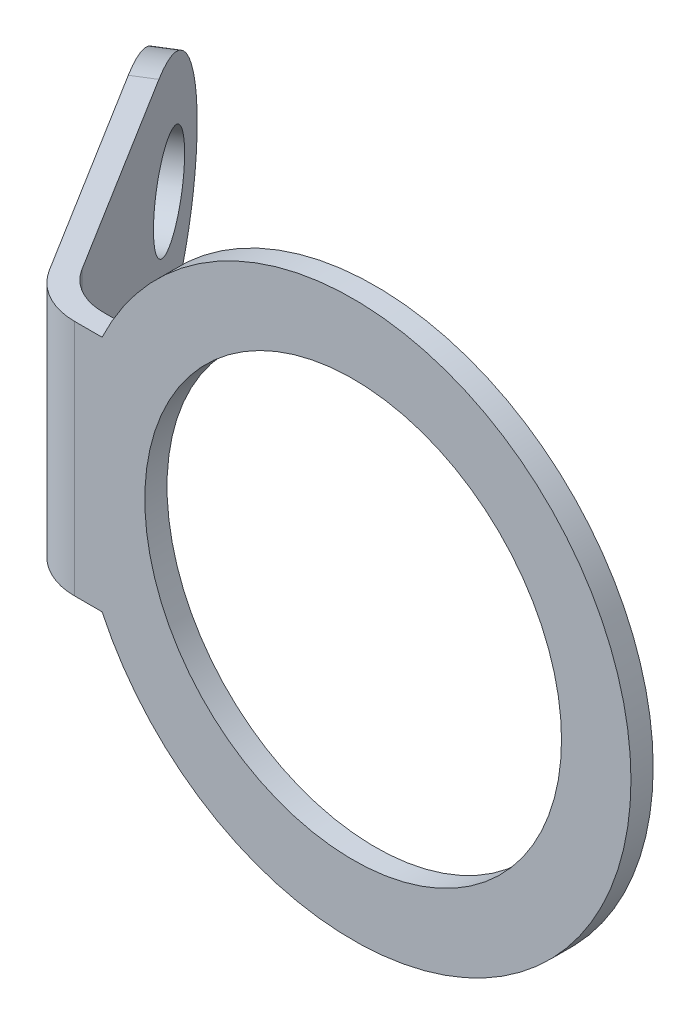
ISO-10303-21;
HEADER;
FILE_DESCRIPTION(('STEP AP214'),'2;1');
FILE_NAME('part.step','',(''),(''),'','','');
FILE_SCHEMA(('AUTOMOTIVE_DESIGN { 1 0 10303 214 1 1 1 1 }'));
ENDSEC;
DATA;
#1=APPLICATION_CONTEXT('core data for automotive mechanical design processes');
#2=APPLICATION_PROTOCOL_DEFINITION('international standard','automotive_design',2000,#1);
#3=PRODUCT_CONTEXT('',#1,'mechanical');
#4=PRODUCT('Part','Part','',(#3));
#5=PRODUCT_RELATED_PRODUCT_CATEGORY('part','',(#4));
#6=PRODUCT_DEFINITION_FORMATION('','',#4);
#7=PRODUCT_DEFINITION_CONTEXT('part definition',#1,'design');
#8=PRODUCT_DEFINITION('design','',#6,#7);
#9=PRODUCT_DEFINITION_SHAPE('','',#8);
#10=(LENGTH_UNIT() NAMED_UNIT(*) SI_UNIT(.MILLI.,.METRE.));
#11=(NAMED_UNIT(*) PLANE_ANGLE_UNIT() SI_UNIT($,.RADIAN.));
#12=(NAMED_UNIT(*) SI_UNIT($,.STERADIAN.) SOLID_ANGLE_UNIT());
#13=UNCERTAINTY_MEASURE_WITH_UNIT(LENGTH_MEASURE(1.E-05),#10,'distance_accuracy_value','');
#14=(GEOMETRIC_REPRESENTATION_CONTEXT(3) GLOBAL_UNCERTAINTY_ASSIGNED_CONTEXT((#13)) GLOBAL_UNIT_ASSIGNED_CONTEXT((#10,
#11,#12)) REPRESENTATION_CONTEXT('',''));
#15=CARTESIAN_POINT('',(0.,0.,0.));
#16=DIRECTION('',(0.,0.,1.));
#17=DIRECTION('',(1.,0.,0.));
#18=AXIS2_PLACEMENT_3D('',#15,#16,#17);
#19=CARTESIAN_POINT('',(-7.36753722158935,2.7178,0.267996011223815));
#20=DIRECTION('',(0.849523235706866,0.,-0.527551203196559));
#21=DIRECTION('',(-0.527551203196559,0.,-0.849523235706866));
#22=AXIS2_PLACEMENT_3D('',#19,#20,#21);
#23=PLANE('',#22);
#24=DIRECTION('',(0.52755120319652,0.,0.84952323570689));
#25=VECTOR('',#24,1.);
#26=CARTESIAN_POINT('',(-7.36753722158935,2.7178,0.267996011223815));
#27=LINE('',#26,#25);
#28=CARTESIAN_POINT('',(-10.6247778814616,2.7178,-4.9771851353348));
#29=VERTEX_POINT('',#28);
#30=CARTESIAN_POINT('',(-7.66562063527128,2.7178,-0.212011966328458));
#31=VERTEX_POINT('',#30);
#32=EDGE_CURVE('E186',#29,#31,#27,.T.);
#33=ORIENTED_EDGE('',*,*,#32,.F.);
#34=CARTESIAN_POINT('',(-10.6247778814618,0.,-4.97718513533465));
#35=DIRECTION('',(0.849523235706866,0.,-0.527551203196559));
#36=DIRECTION('',(-0.527551203196559,0.,-0.849523235706866));
#37=AXIS2_PLACEMENT_3D('',#34,#35,#36);
#38=CIRCLE('',#37,2.7178);
#39=CARTESIAN_POINT('',(-12.0585565415091,-4.1286418728248E-13,-7.28601938533898));
#40=VERTEX_POINT('',#39);
#41=EDGE_CURVE('E163',#29,#40,#38,.F.);
#42=ORIENTED_EDGE('',*,*,#41,.T.);
#43=CARTESIAN_POINT('',(-10.6247778814618,-4.12886158858659E-13,-4.97718513533465));
#44=DIRECTION('',(0.849523235706866,0.,-0.527551203196559));
#45=DIRECTION('',(-0.527551203196559,0.,-0.849523235706866));
#46=AXIS2_PLACEMENT_3D('',#43,#44,#45);
#47=CIRCLE('',#46,2.7178);
#48=CARTESIAN_POINT('',(-10.6247778814615,-2.7178,-4.97718513533469));
#49=VERTEX_POINT('',#48);
#50=EDGE_CURVE('E161',#40,#49,#47,.F.);
#51=ORIENTED_EDGE('',*,*,#50,.T.);
#52=DIRECTION('',(0.52755120319652,0.,0.84952323570689));
#53=VECTOR('',#52,1.);
#54=CARTESIAN_POINT('',(-7.36753722158935,-2.7178,0.267996011223815));
#55=LINE('',#54,#53);
#56=CARTESIAN_POINT('',(-7.66562063527128,-2.7178,-0.212011966328458));
#57=VERTEX_POINT('',#56);
#58=EDGE_CURVE('E171',#49,#57,#55,.T.);
#59=ORIENTED_EDGE('',*,*,#58,.T.);
#60=DIRECTION('',(0.,-1.,0.));
#61=VECTOR('',#60,1.);
#62=CARTESIAN_POINT('',(-7.6656206352713,2.7178,-0.212011966328445));
#63=LINE('',#62,#61);
#64=EDGE_CURVE('E153',#57,#31,#63,.F.);
#65=ORIENTED_EDGE('',*,*,#64,.T.);
#66=EDGE_LOOP('',(#33,#42,#51,#59,#65));
#67=FACE_BOUND('',#66,.T.);
#68=CARTESIAN_POINT('',(-11.0044060101016,0.,-5.58850573180615));
#69=DIRECTION('',(-0.849523235706866,0.,0.527551203196559));
#70=DIRECTION('',(0.527551203196559,0.,0.849523235706866));
#71=AXIS2_PLACEMENT_3D('',#68,#69,#70);
#72=CIRCLE('',#71,1.10489999999999);
#73=CARTESIAN_POINT('',(-10.4215146856897,0.,-4.64986750867365));
#74=VERTEX_POINT('',#73);
#75=EDGE_CURVE('E174',#74,#74,#72,.T.);
#76=ORIENTED_EDGE('',*,*,#75,.F.);
#77=EDGE_LOOP('',(#76));
#78=FACE_BOUND('',#77,.T.);
#79=ADVANCED_FACE('F33',(#67,#78),#23,.F.);
#80=CARTESIAN_POINT('',(0.,0.,0.508));
#81=DIRECTION('',(0.,0.,1.));
#82=DIRECTION('',(1.,0.,0.));
#83=AXIS2_PLACEMENT_3D('',#80,#81,#82);
#84=PLANE('',#83);
#85=DIRECTION('',(-1.,0.,0.));
#86=VECTOR('',#85,1.);
#87=CARTESIAN_POINT('',(-6.35,2.7178,0.508));
#88=LINE('',#87,#86);
#89=CARTESIAN_POINT('',(-5.73899496079235,2.7178,0.508));
#90=VERTEX_POINT('',#89);
#91=CARTESIAN_POINT('',(-6.37094722405404,2.7178,0.508));
#92=VERTEX_POINT('',#91);
#93=EDGE_CURVE('E116',#90,#92,#88,.T.);
#94=ORIENTED_EDGE('',*,*,#93,.T.);
#95=DIRECTION('',(0.,-1.,0.));
#96=VECTOR('',#95,1.);
#97=CARTESIAN_POINT('',(-6.37094722405404,-2.7178,0.508));
#98=LINE('',#97,#96);
#99=CARTESIAN_POINT('',(-6.37094722405404,-2.71780000000005,0.508));
#100=VERTEX_POINT('',#99);
#101=EDGE_CURVE('E147',#92,#100,#98,.T.);
#102=ORIENTED_EDGE('',*,*,#101,.T.);
#103=DIRECTION('',(1.,0.,0.));
#104=VECTOR('',#103,1.);
#105=CARTESIAN_POINT('',(-5.73899496079235,-2.7178,0.508));
#106=LINE('',#105,#104);
#107=CARTESIAN_POINT('',(-5.73899496079235,-2.7178,0.508));
#108=VERTEX_POINT('',#107);
#109=EDGE_CURVE('E187',#100,#108,#106,.T.);
#110=ORIENTED_EDGE('',*,*,#109,.T.);
#111=CARTESIAN_POINT('',(0.,0.,0.508));
#112=DIRECTION('',(0.,0.,1.));
#113=DIRECTION('',(1.,0.,0.));
#114=AXIS2_PLACEMENT_3D('',#111,#112,#113);
#115=CIRCLE('',#114,6.35);
#116=EDGE_CURVE('E124',#108,#90,#115,.T.);
#117=ORIENTED_EDGE('',*,*,#116,.T.);
#118=EDGE_LOOP('',(#94,#102,#110,#117));
#119=FACE_BOUND('',#118,.T.);
#120=CARTESIAN_POINT('',(0.,0.,0.508));
#121=DIRECTION('',(0.,0.,1.));
#122=DIRECTION('',(1.,0.,0.));
#123=AXIS2_PLACEMENT_3D('',#120,#121,#122);
#124=CIRCLE('',#123,4.7625);
#125=CARTESIAN_POINT('',(4.7625,0.,0.508));
#126=VERTEX_POINT('',#125);
#127=EDGE_CURVE('E131',#126,#126,#124,.T.);
#128=ORIENTED_EDGE('',*,*,#127,.F.);
#129=EDGE_LOOP('',(#128));
#130=FACE_BOUND('',#129,.T.);
#131=ADVANCED_FACE('F211',(#119,#130),#84,.T.);
#132=CARTESIAN_POINT('',(0.,0.,0.));
#133=DIRECTION('',(0.,0.,1.));
#134=DIRECTION('',(1.,0.,0.));
#135=AXIS2_PLACEMENT_3D('',#132,#133,#134);
#136=PLANE('',#135);
#137=DIRECTION('',(1.,0.,0.));
#138=VECTOR('',#137,1.);
#139=CARTESIAN_POINT('',(-5.73899496079235,-2.7178,0.));
#140=LINE('',#139,#138);
#141=CARTESIAN_POINT('',(-6.22968917560495,-2.71780000000004,0.));
#142=VERTEX_POINT('',#141);
#143=CARTESIAN_POINT('',(-5.73899496079235,-2.7178,0.));
#144=VERTEX_POINT('',#143);
#145=EDGE_CURVE('E105',#142,#144,#140,.T.);
#146=ORIENTED_EDGE('',*,*,#145,.F.);
#147=DIRECTION('',(0.,-1.,0.));
#148=VECTOR('',#147,1.);
#149=CARTESIAN_POINT('',(-6.22968917560495,2.7178,0.));
#150=LINE('',#149,#148);
#151=CARTESIAN_POINT('',(-6.22968917560495,2.7178,0.));
#152=VERTEX_POINT('',#151);
#153=EDGE_CURVE('E142',#142,#152,#150,.F.);
#154=ORIENTED_EDGE('',*,*,#153,.T.);
#155=DIRECTION('',(-1.,0.,0.));
#156=VECTOR('',#155,1.);
#157=CARTESIAN_POINT('',(-6.35,2.7178,0.));
#158=LINE('',#157,#156);
#159=CARTESIAN_POINT('',(-5.73899496079235,2.7178,0.));
#160=VERTEX_POINT('',#159);
#161=EDGE_CURVE('E115',#160,#152,#158,.T.);
#162=ORIENTED_EDGE('',*,*,#161,.F.);
#163=CARTESIAN_POINT('',(0.,0.,0.));
#164=DIRECTION('',(0.,0.,1.));
#165=DIRECTION('',(1.,0.,0.));
#166=AXIS2_PLACEMENT_3D('',#163,#164,#165);
#167=CIRCLE('',#166,6.35);
#168=EDGE_CURVE('E122',#144,#160,#167,.T.);
#169=ORIENTED_EDGE('',*,*,#168,.F.);
#170=EDGE_LOOP('',(#146,#154,#162,#169));
#171=FACE_BOUND('',#170,.T.);
#172=CARTESIAN_POINT('',(0.,0.,0.));
#173=DIRECTION('',(0.,0.,1.));
#174=DIRECTION('',(1.,0.,0.));
#175=AXIS2_PLACEMENT_3D('',#172,#173,#174);
#176=CIRCLE('',#175,4.7625);
#177=CARTESIAN_POINT('',(4.7625,0.,0.));
#178=VERTEX_POINT('',#177);
#179=EDGE_CURVE('E136',#178,#178,#176,.T.);
#180=ORIENTED_EDGE('',*,*,#179,.T.);
#181=EDGE_LOOP('',(#180));
#182=FACE_BOUND('',#181,.T.);
#183=ADVANCED_FACE('F128',(#171,#182),#136,.F.);
#184=CARTESIAN_POINT('',(0.,0.,0.508));
#185=DIRECTION('',(0.,0.,-1.));
#186=DIRECTION('',(-1.,0.,0.));
#187=AXIS2_PLACEMENT_3D('',#184,#185,#186);
#188=CYLINDRICAL_SURFACE('',#187,6.35);
#189=ORIENTED_EDGE('',*,*,#168,.T.);
#190=DIRECTION('',(0.,0.,1.));
#191=VECTOR('',#190,1.);
#192=CARTESIAN_POINT('',(-5.73899496079235,2.7178,0.));
#193=LINE('',#192,#191);
#194=EDGE_CURVE('E125',#160,#90,#193,.T.);
#195=ORIENTED_EDGE('',*,*,#194,.T.);
#196=ORIENTED_EDGE('',*,*,#116,.F.);
#197=DIRECTION('',(0.,0.,1.));
#198=VECTOR('',#197,1.);
#199=CARTESIAN_POINT('',(-5.73899496079235,-2.7178,0.));
#200=LINE('',#199,#198);
#201=EDGE_CURVE('E109',#144,#108,#200,.T.);
#202=ORIENTED_EDGE('',*,*,#201,.F.);
#203=EDGE_LOOP('',(#189,#195,#196,#202));
#204=FACE_BOUND('',#203,.T.);
#205=ADVANCED_FACE('F120',(#204),#188,.T.);
#206=CARTESIAN_POINT('',(0.,0.,0.508));
#207=DIRECTION('',(0.,0.,-1.));
#208=DIRECTION('',(-1.,0.,0.));
#209=AXIS2_PLACEMENT_3D('',#206,#207,#208);
#210=CYLINDRICAL_SURFACE('',#209,4.7625);
#211=ORIENTED_EDGE('',*,*,#127,.T.);
#212=EDGE_LOOP('',(#211));
#213=FACE_BOUND('',#212,.T.);
#214=ORIENTED_EDGE('',*,*,#179,.F.);
#215=EDGE_LOOP('',(#214));
#216=FACE_BOUND('',#215,.T.);
#217=ADVANCED_FACE('F196',(#213,#216),#210,.F.);
#218=CARTESIAN_POINT('',(-6.35,2.7178,0.));
#219=DIRECTION('',(0.,1.,0.));
#220=DIRECTION('',(0.,0.,1.));
#221=AXIS2_PLACEMENT_3D('',#218,#219,#220);
#222=PLANE('',#221);
#223=DIRECTION('',(-0.52755120319652,0.,-0.84952323570689));
#224=VECTOR('',#223,1.);
#225=CARTESIAN_POINT('',(-6.93597941785025,2.7178,0.));
#226=LINE('',#225,#224);
#227=CARTESIAN_POINT('',(-7.3085836849527,2.7178,-0.60000997194042));
#228=VERTEX_POINT('',#227);
#229=CARTESIAN_POINT('',(-10.1932200777225,2.7178,-5.24518114655863));
#230=VERTEX_POINT('',#229);
#231=EDGE_CURVE('E183',#228,#230,#226,.T.);
#232=ORIENTED_EDGE('',*,*,#231,.T.);
#233=DIRECTION('',(-0.849523235706889,0.,0.527551203196521));
#234=VECTOR('',#233,1.);
#235=CARTESIAN_POINT('',(-10.6247778814616,2.7178,-4.9771851353348));
#236=LINE('',#235,#234);
#237=EDGE_CURVE('E158',#230,#29,#236,.T.);
#238=ORIENTED_EDGE('',*,*,#237,.T.);
#239=ORIENTED_EDGE('',*,*,#32,.T.);
#240=CARTESIAN_POINT('',(-6.37094722405404,2.7178,-1.016));
#241=DIRECTION('',(0.,1.,0.));
#242=DIRECTION('',(0.,0.,1.));
#243=AXIS2_PLACEMENT_3D('',#240,#241,#242);
#244=CIRCLE('',#243,1.524);
#245=EDGE_CURVE('E156',#31,#92,#244,.T.);
#246=ORIENTED_EDGE('',*,*,#245,.T.);
#247=ORIENTED_EDGE('',*,*,#93,.F.);
#248=ORIENTED_EDGE('',*,*,#194,.F.);
#249=ORIENTED_EDGE('',*,*,#161,.T.);
#250=CARTESIAN_POINT('',(-6.22968917560495,2.7178,-1.27));
#251=DIRECTION('',(0.,1.,0.));
#252=DIRECTION('',(0.,0.,1.));
#253=AXIS2_PLACEMENT_3D('',#250,#251,#252);
#254=CIRCLE('',#253,1.27);
#255=EDGE_CURVE('E145',#152,#228,#254,.F.);
#256=ORIENTED_EDGE('',*,*,#255,.T.);
#257=EDGE_LOOP('',(#232,#238,#239,#246,#247,#248,#249,#256));
#258=FACE_BOUND('',#257,.T.);
#259=ADVANCED_FACE('F198',(#258),#222,.T.);
#260=CARTESIAN_POINT('',(-5.73899496079235,-2.7178,0.));
#261=DIRECTION('',(0.,-1.,0.));
#262=DIRECTION('',(1.,0.,0.));
#263=AXIS2_PLACEMENT_3D('',#260,#261,#262);
#264=PLANE('',#263);
#265=ORIENTED_EDGE('',*,*,#58,.F.);
#266=DIRECTION('',(-0.849523235706889,0.,0.527551203196521));
#267=VECTOR('',#266,1.);
#268=CARTESIAN_POINT('',(-10.1932200777224,-2.71780000000038,-5.24518114655853));
#269=LINE('',#268,#267);
#270=CARTESIAN_POINT('',(-10.1932200777224,-2.7178,-5.24518114655853));
#271=VERTEX_POINT('',#270);
#272=EDGE_CURVE('E11',#49,#271,#269,.F.);
#273=ORIENTED_EDGE('',*,*,#272,.T.);
#274=DIRECTION('',(-0.52755120319652,0.,-0.84952323570689));
#275=VECTOR('',#274,1.);
#276=CARTESIAN_POINT('',(-6.93597941785025,-2.7178,0.));
#277=LINE('',#276,#275);
#278=CARTESIAN_POINT('',(-7.3085836849527,-2.7178,-0.60000997194042));
#279=VERTEX_POINT('',#278);
#280=EDGE_CURVE('E168',#279,#271,#277,.T.);
#281=ORIENTED_EDGE('',*,*,#280,.F.);
#282=CARTESIAN_POINT('',(-6.22968917560495,-2.71780000000004,-1.27));
#283=DIRECTION('',(0.,-1.,0.));
#284=DIRECTION('',(1.,0.,0.));
#285=AXIS2_PLACEMENT_3D('',#282,#283,#284);
#286=CIRCLE('',#285,1.27);
#287=EDGE_CURVE('E111',#279,#142,#286,.F.);
#288=ORIENTED_EDGE('',*,*,#287,.T.);
#289=ORIENTED_EDGE('',*,*,#145,.T.);
#290=ORIENTED_EDGE('',*,*,#201,.T.);
#291=ORIENTED_EDGE('',*,*,#109,.F.);
#292=CARTESIAN_POINT('',(-6.37094722405404,-2.71780000000005,-1.016));
#293=DIRECTION('',(0.,-1.,0.));
#294=DIRECTION('',(1.,0.,0.));
#295=AXIS2_PLACEMENT_3D('',#292,#293,#294);
#296=CIRCLE('',#295,1.524);
#297=EDGE_CURVE('E150',#100,#57,#296,.T.);
#298=ORIENTED_EDGE('',*,*,#297,.T.);
#299=EDGE_LOOP('',(#265,#273,#281,#288,#289,#290,#291,#298));
#300=FACE_BOUND('',#299,.T.);
#301=ADVANCED_FACE('F107',(#300),#264,.T.);
#302=CARTESIAN_POINT('',(-6.93597941785025,2.7178,0.));
#303=DIRECTION('',(-0.84952323570689,0.,0.52755120319652));
#304=DIRECTION('',(0.52755120319652,0.,0.84952323570689));
#305=AXIS2_PLACEMENT_3D('',#302,#303,#304);
#306=PLANE('',#305);
#307=CARTESIAN_POINT('',(-10.5728482063622,0.,-5.85650174303017));
#308=DIRECTION('',(-0.84952323570689,0.,0.52755120319652));
#309=DIRECTION('',(0.52755120319652,0.,0.84952323570689));
#310=AXIS2_PLACEMENT_3D('',#307,#308,#309);
#311=CIRCLE('',#310,1.10489999999999);
#312=CARTESIAN_POINT('',(-9.98995688195038,0.,-4.91786351989764));
#313=VERTEX_POINT('',#312);
#314=EDGE_CURVE('E37',#313,#313,#311,.T.);
#315=ORIENTED_EDGE('',*,*,#314,.T.);
#316=EDGE_LOOP('',(#315));
#317=FACE_BOUND('',#316,.T.);
#318=CARTESIAN_POINT('',(-10.1932200777225,-3.76434994286981E-13,-5.24518114655863));
#319=DIRECTION('',(-0.84952323570689,0.,0.52755120319652));
#320=DIRECTION('',(0.52755120319652,0.,0.84952323570689));
#321=AXIS2_PLACEMENT_3D('',#318,#319,#320);
#322=CIRCLE('',#321,2.7178);
#323=CARTESIAN_POINT('',(-11.62699873777,-3.76434994286967E-13,-7.55401539656281));
#324=VERTEX_POINT('',#323);
#325=EDGE_CURVE('E50',#271,#324,#322,.F.);
#326=ORIENTED_EDGE('',*,*,#325,.T.);
#327=CARTESIAN_POINT('',(-10.1932200777225,0.,-5.24518114655863));
#328=DIRECTION('',(-0.84952323570689,0.,0.52755120319652));
#329=DIRECTION('',(0.52755120319652,0.,0.84952323570689));
#330=AXIS2_PLACEMENT_3D('',#327,#328,#329);
#331=CIRCLE('',#330,2.7178);
#332=EDGE_CURVE('E42',#324,#230,#331,.F.);
#333=ORIENTED_EDGE('',*,*,#332,.T.);
#334=ORIENTED_EDGE('',*,*,#231,.F.);
#335=DIRECTION('',(0.,-1.,0.));
#336=VECTOR('',#335,1.);
#337=CARTESIAN_POINT('',(-7.3085836849527,-2.7178,-0.60000997194042));
#338=LINE('',#337,#336);
#339=EDGE_CURVE('E133',#228,#279,#338,.T.);
#340=ORIENTED_EDGE('',*,*,#339,.T.);
#341=ORIENTED_EDGE('',*,*,#280,.T.);
#342=EDGE_LOOP('',(#326,#333,#334,#340,#341));
#343=FACE_BOUND('',#342,.T.);
#344=ADVANCED_FACE('F223',(#317,#343),#306,.F.);
#345=CARTESIAN_POINT('',(-6.22968917560495,2.7178,-1.27));
#346=DIRECTION('',(0.,1.,0.));
#347=DIRECTION('',(0.,0.,1.));
#348=AXIS2_PLACEMENT_3D('',#345,#346,#347);
#349=CYLINDRICAL_SURFACE('',#348,1.27);
#350=ORIENTED_EDGE('',*,*,#255,.F.);
#351=ORIENTED_EDGE('',*,*,#153,.F.);
#352=ORIENTED_EDGE('',*,*,#287,.F.);
#353=ORIENTED_EDGE('',*,*,#339,.F.);
#354=EDGE_LOOP('',(#350,#351,#352,#353));
#355=FACE_BOUND('',#354,.T.);
#356=ADVANCED_FACE('F225',(#355),#349,.F.);
#357=CARTESIAN_POINT('',(-6.37094722405404,0.,-1.016));
#358=DIRECTION('',(0.,1.,0.));
#359=DIRECTION('',(0.,0.,1.));
#360=AXIS2_PLACEMENT_3D('',#357,#358,#359);
#361=CYLINDRICAL_SURFACE('',#360,1.524);
#362=ORIENTED_EDGE('',*,*,#245,.F.);
#363=ORIENTED_EDGE('',*,*,#64,.F.);
#364=ORIENTED_EDGE('',*,*,#297,.F.);
#365=ORIENTED_EDGE('',*,*,#101,.F.);
#366=EDGE_LOOP('',(#362,#363,#364,#365));
#367=FACE_BOUND('',#366,.T.);
#368=ADVANCED_FACE('F243',(#367),#361,.T.);
#369=CARTESIAN_POINT('',(-10.1932200777223,-3.76434994286967E-13,-5.24518114655873));
#370=DIRECTION('',(0.849523235706889,0.,-0.527551203196521));
#371=DIRECTION('',(-0.527551203196521,0.,-0.849523235706889));
#372=AXIS2_PLACEMENT_3D('',#369,#370,#371);
#373=CYLINDRICAL_SURFACE('',#372,2.7178);
#374=DIRECTION('',(-0.849523235706889,0.,0.527551203196521));
#375=VECTOR('',#374,1.);
#376=CARTESIAN_POINT('',(-12.0585565415092,-4.12886158858653E-13,-7.28601938533888));
#377=LINE('',#376,#375);
#378=EDGE_CURVE('E166',#324,#40,#377,.T.);
#379=ORIENTED_EDGE('',*,*,#378,.F.);
#380=ORIENTED_EDGE('',*,*,#325,.F.);
#381=ORIENTED_EDGE('',*,*,#272,.F.);
#382=ORIENTED_EDGE('',*,*,#50,.F.);
#383=EDGE_LOOP('',(#379,#380,#381,#382));
#384=FACE_BOUND('',#383,.T.);
#385=ADVANCED_FACE('F35',(#384),#373,.T.);
#386=CARTESIAN_POINT('',(-9.77032475103708,0.,-5.50779778733058));
#387=DIRECTION('',(0.849523235706889,0.,-0.527551203196521));
#388=DIRECTION('',(-0.527551203196521,0.,-0.849523235706889));
#389=AXIS2_PLACEMENT_3D('',#386,#387,#388);
#390=CYLINDRICAL_SURFACE('',#389,2.7178);
#391=ORIENTED_EDGE('',*,*,#332,.F.);
#392=ORIENTED_EDGE('',*,*,#378,.T.);
#393=ORIENTED_EDGE('',*,*,#41,.F.);
#394=ORIENTED_EDGE('',*,*,#237,.F.);
#395=EDGE_LOOP('',(#391,#392,#393,#394));
#396=FACE_BOUND('',#395,.T.);
#397=ADVANCED_FACE('F259',(#396),#390,.T.);
#398=CARTESIAN_POINT('',(-11.0044060101016,0.,-5.58850573180615));
#399=DIRECTION('',(-0.849523235706866,0.,0.527551203196559));
#400=DIRECTION('',(0.527551203196559,0.,0.849523235706866));
#401=AXIS2_PLACEMENT_3D('',#398,#399,#400);
#402=CYLINDRICAL_SURFACE('',#401,1.10489999999999);
#403=ORIENTED_EDGE('',*,*,#75,.T.);
#404=EDGE_LOOP('',(#403));
#405=FACE_BOUND('',#404,.T.);
#406=ORIENTED_EDGE('',*,*,#314,.F.);
#407=EDGE_LOOP('',(#406));
#408=FACE_BOUND('',#407,.T.);
#409=ADVANCED_FACE('F222',(#405,#408),#402,.F.);
#410=CLOSED_SHELL('',(#79,#131,#183,#205,#217,#259,#301,#344,#356,#368,#385,#397,#409));
#411=MANIFOLD_SOLID_BREP('B2',#410);
#412=ADVANCED_BREP_SHAPE_REPRESENTATION('',(#18,#411),#14);
#413=SHAPE_DEFINITION_REPRESENTATION(#9,#412);
ENDSEC;
END-ISO-10303-21;
